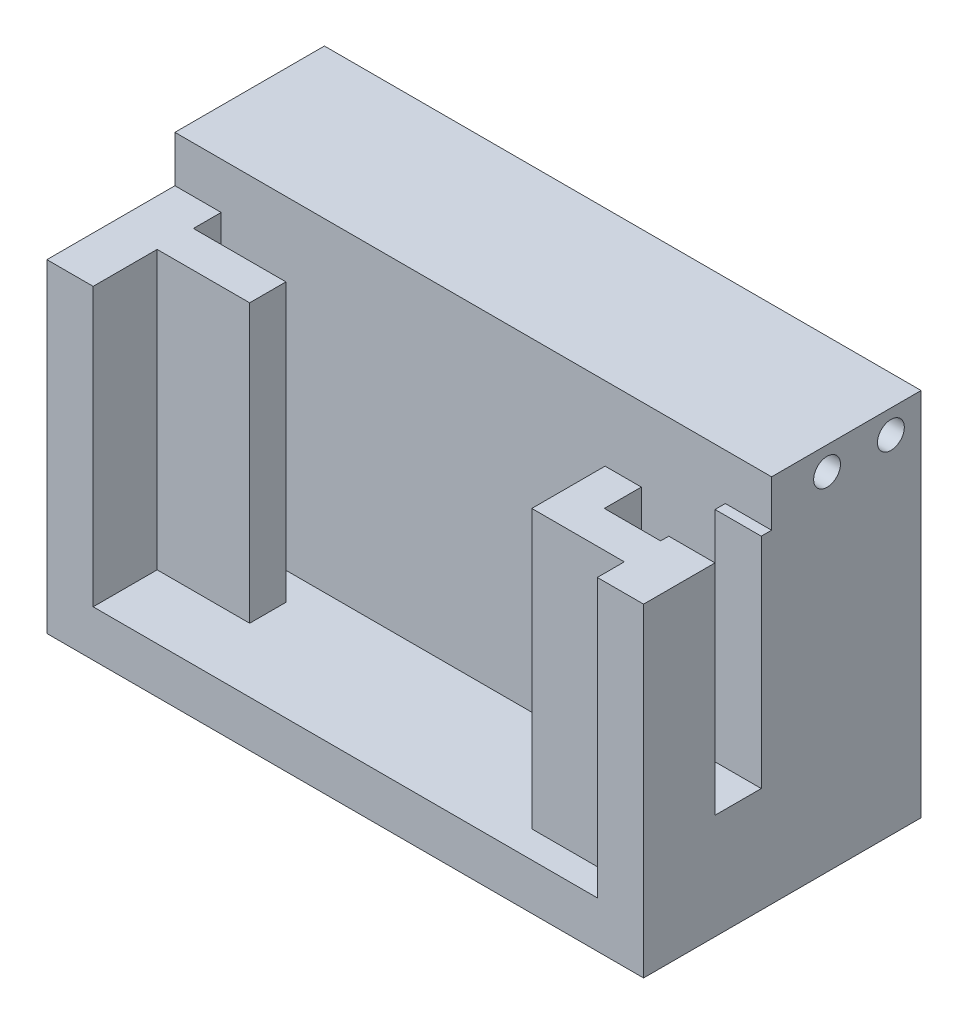
ISO-10303-21;
HEADER;
FILE_DESCRIPTION(('STEP AP214'),'2;1');
FILE_NAME('part.step','',(''),(''),'','','');
FILE_SCHEMA(('AUTOMOTIVE_DESIGN { 1 0 10303 214 1 1 1 1 }'));
ENDSEC;
DATA;
#1=APPLICATION_CONTEXT('core data for automotive mechanical design processes');
#2=APPLICATION_PROTOCOL_DEFINITION('international standard','automotive_design',2000,#1);
#3=PRODUCT_CONTEXT('',#1,'mechanical');
#4=PRODUCT('Part','Part','',(#3));
#5=PRODUCT_RELATED_PRODUCT_CATEGORY('part','',(#4));
#6=PRODUCT_DEFINITION_FORMATION('','',#4);
#7=PRODUCT_DEFINITION_CONTEXT('part definition',#1,'design');
#8=PRODUCT_DEFINITION('design','',#6,#7);
#9=PRODUCT_DEFINITION_SHAPE('','',#8);
#10=(LENGTH_UNIT() NAMED_UNIT(*) SI_UNIT(.MILLI.,.METRE.));
#11=(NAMED_UNIT(*) PLANE_ANGLE_UNIT() SI_UNIT($,.RADIAN.));
#12=(NAMED_UNIT(*) SI_UNIT($,.STERADIAN.) SOLID_ANGLE_UNIT());
#13=UNCERTAINTY_MEASURE_WITH_UNIT(LENGTH_MEASURE(1.E-05),#10,'distance_accuracy_value','');
#14=(GEOMETRIC_REPRESENTATION_CONTEXT(3) GLOBAL_UNCERTAINTY_ASSIGNED_CONTEXT((#13)) GLOBAL_UNIT_ASSIGNED_CONTEXT((#10,
#11,#12)) REPRESENTATION_CONTEXT('',''));
#15=CARTESIAN_POINT('',(0.,0.,0.));
#16=DIRECTION('',(0.,0.,1.));
#17=DIRECTION('',(1.,0.,0.));
#18=AXIS2_PLACEMENT_3D('',#15,#16,#17);
#19=CARTESIAN_POINT('',(-35.5854500032132,20.1611721611722,5.));
#20=DIRECTION('',(0.,-1.,0.));
#21=DIRECTION('',(0.,0.,-1.));
#22=AXIS2_PLACEMENT_3D('',#19,#20,#21);
#23=PLANE('',#22);
#24=DIRECTION('',(0.,0.,1.));
#25=VECTOR('',#24,1.);
#26=CARTESIAN_POINT('',(18.9145499967868,20.1611721611722,0.));
#27=LINE('',#26,#25);
#28=CARTESIAN_POINT('',(18.9145499967868,20.1611721611722,16.162047810198));
#29=VERTEX_POINT('',#28);
#30=CARTESIAN_POINT('',(18.9145499967868,20.1611721611722,17.2766885501687));
#31=VERTEX_POINT('',#30);
#32=EDGE_CURVE('E373',#29,#31,#27,.T.);
#33=ORIENTED_EDGE('',*,*,#32,.T.);
#34=DIRECTION('',(-1.,0.,0.));
#35=VECTOR('',#34,1.);
#36=CARTESIAN_POINT('',(25.9145499967868,20.1611721611722,17.2766885501687));
#37=LINE('',#36,#35);
#38=CARTESIAN_POINT('',(23.9145499967868,20.1611721611722,17.2766885501687));
#39=VERTEX_POINT('',#38);
#40=EDGE_CURVE('E234',#39,#31,#37,.T.);
#41=ORIENTED_EDGE('',*,*,#40,.F.);
#42=DIRECTION('',(0.,0.,1.));
#43=VECTOR('',#42,1.);
#44=CARTESIAN_POINT('',(23.9145499967868,20.1611721611722,0.));
#45=LINE('',#44,#43);
#46=CARTESIAN_POINT('',(23.9145499967868,20.1611721611722,16.162047810198));
#47=VERTEX_POINT('',#46);
#48=EDGE_CURVE('E364',#47,#39,#45,.T.);
#49=ORIENTED_EDGE('',*,*,#48,.F.);
#50=DIRECTION('',(1.,0.,0.));
#51=VECTOR('',#50,1.);
#52=CARTESIAN_POINT('',(-40.5854500032132,20.1611721611722,16.162047810198));
#53=LINE('',#52,#51);
#54=EDGE_CURVE('E325',#29,#47,#53,.T.);
#55=ORIENTED_EDGE('',*,*,#54,.F.);
#56=EDGE_LOOP('',(#33,#41,#49,#55));
#57=FACE_BOUND('',#56,.T.);
#58=ADVANCED_FACE('F34',(#57),#23,.F.);
#59=CARTESIAN_POINT('',(0.,-9.83882783882784,0.));
#60=DIRECTION('',(0.,-1.,0.));
#61=DIRECTION('',(0.,0.,-1.));
#62=AXIS2_PLACEMENT_3D('',#59,#60,#61);
#63=PLANE('',#62);
#64=DIRECTION('',(0.,0.,1.));
#65=VECTOR('',#64,1.);
#66=CARTESIAN_POINT('',(8.91454999678682,-9.83882783882784,23.162047810198));
#67=LINE('',#66,#65);
#68=CARTESIAN_POINT('',(8.91454999678682,-9.83882783882784,19.162047810198));
#69=VERTEX_POINT('',#68);
#70=CARTESIAN_POINT('',(8.91454999678682,-9.83882783882784,27.081023910198));
#71=VERTEX_POINT('',#70);
#72=EDGE_CURVE('E269',#69,#71,#67,.T.);
#73=ORIENTED_EDGE('',*,*,#72,.F.);
#74=DIRECTION('',(-1.,0.,0.));
#75=VECTOR('',#74,1.);
#76=CARTESIAN_POINT('',(8.91454999678682,-9.83882783882784,19.162047810198));
#77=LINE('',#76,#75);
#78=CARTESIAN_POINT('',(12.8335260967868,-9.83882783882784,19.162047810198));
#79=VERTEX_POINT('',#78);
#80=EDGE_CURVE('E259',#79,#69,#77,.T.);
#81=ORIENTED_EDGE('',*,*,#80,.F.);
#82=DIRECTION('',(0.,0.,1.));
#83=VECTOR('',#82,1.);
#84=CARTESIAN_POINT('',(12.8335260967868,-9.83882783882784,19.162047810198));
#85=LINE('',#84,#83);
#86=CARTESIAN_POINT('',(12.8335260967868,-9.83882783882784,23.162047810198));
#87=VERTEX_POINT('',#86);
#88=EDGE_CURVE('E262',#79,#87,#85,.T.);
#89=ORIENTED_EDGE('',*,*,#88,.T.);
#90=DIRECTION('',(1.,0.,0.));
#91=VECTOR('',#90,1.);
#92=CARTESIAN_POINT('',(8.91454999678682,-9.83882783882784,23.162047810198));
#93=LINE('',#92,#91);
#94=CARTESIAN_POINT('',(18.9145499967868,-9.83882783882784,23.162047810198));
#95=VERTEX_POINT('',#94);
#96=EDGE_CURVE('E285',#87,#95,#93,.T.);
#97=ORIENTED_EDGE('',*,*,#96,.T.);
#98=DIRECTION('',(0.,0.,-1.));
#99=VECTOR('',#98,1.);
#100=CARTESIAN_POINT('',(18.9145499967868,-9.83882783882784,0.));
#101=LINE('',#100,#99);
#102=CARTESIAN_POINT('',(18.9145499967868,-9.83882783882783,16.162047810198));
#103=VERTEX_POINT('',#102);
#104=EDGE_CURVE('E379',#95,#103,#101,.T.);
#105=ORIENTED_EDGE('',*,*,#104,.T.);
#106=DIRECTION('',(1.,0.,0.));
#107=VECTOR('',#106,1.);
#108=CARTESIAN_POINT('',(0.,-9.83882783882784,16.162047810198));
#109=LINE('',#108,#107);
#110=CARTESIAN_POINT('',(-35.5854500032132,-9.83882783882784,16.162047810198));
#111=VERTEX_POINT('',#110);
#112=EDGE_CURVE('E416',#111,#103,#109,.T.);
#113=ORIENTED_EDGE('',*,*,#112,.F.);
#114=DIRECTION('',(0.,0.,1.));
#115=VECTOR('',#114,1.);
#116=CARTESIAN_POINT('',(-35.5854500032132,-9.83882783882784,0.));
#117=LINE('',#116,#115);
#118=CARTESIAN_POINT('',(-35.5854500032132,-9.83882783882784,19.162047810198));
#119=VERTEX_POINT('',#118);
#120=EDGE_CURVE('E396',#111,#119,#117,.T.);
#121=ORIENTED_EDGE('',*,*,#120,.T.);
#122=DIRECTION('',(-1.,0.,0.));
#123=VECTOR('',#122,1.);
#124=CARTESIAN_POINT('',(-25.5854500032132,-9.83882783882784,19.162047810198));
#125=LINE('',#124,#123);
#126=CARTESIAN_POINT('',(-25.5854500032132,-9.83882783882784,19.162047810198));
#127=VERTEX_POINT('',#126);
#128=EDGE_CURVE('E305',#127,#119,#125,.T.);
#129=ORIENTED_EDGE('',*,*,#128,.F.);
#130=DIRECTION('',(0.,0.,-1.));
#131=VECTOR('',#130,1.);
#132=CARTESIAN_POINT('',(-25.5854500032132,-9.83882783882784,23.081023905099));
#133=LINE('',#132,#131);
#134=CARTESIAN_POINT('',(-25.5854500032132,-9.83882783882784,23.081023905099));
#135=VERTEX_POINT('',#134);
#136=EDGE_CURVE('E291',#135,#127,#133,.T.);
#137=ORIENTED_EDGE('',*,*,#136,.F.);
#138=DIRECTION('',(-1.,0.,0.));
#139=VECTOR('',#138,1.);
#140=CARTESIAN_POINT('',(-25.5854500032132,-9.83882783882784,23.081023905099));
#141=LINE('',#140,#139);
#142=CARTESIAN_POINT('',(-35.5854500032132,-9.83882783882784,23.081023905099));
#143=VERTEX_POINT('',#142);
#144=EDGE_CURVE('E307',#135,#143,#141,.T.);
#145=ORIENTED_EDGE('',*,*,#144,.T.);
#146=CARTESIAN_POINT('',(-35.5854500032132,-9.83882783882784,30.));
#147=VERTEX_POINT('',#146);
#148=EDGE_CURVE('E382',#143,#147,#117,.T.);
#149=ORIENTED_EDGE('',*,*,#148,.T.);
#150=DIRECTION('',(-1.,0.,0.));
#151=VECTOR('',#150,1.);
#152=CARTESIAN_POINT('',(-40.5854500032132,-9.83882783882784,30.));
#153=LINE('',#152,#151);
#154=CARTESIAN_POINT('',(18.9145499967868,-9.83882783882784,30.));
#155=VERTEX_POINT('',#154);
#156=EDGE_CURVE('E344',#155,#147,#153,.T.);
#157=ORIENTED_EDGE('',*,*,#156,.F.);
#158=CARTESIAN_POINT('',(18.9145499967868,-9.83882783882784,27.081023910198));
#159=VERTEX_POINT('',#158);
#160=EDGE_CURVE('E363',#155,#159,#101,.T.);
#161=ORIENTED_EDGE('',*,*,#160,.T.);
#162=DIRECTION('',(1.,0.,0.));
#163=VECTOR('',#162,1.);
#164=CARTESIAN_POINT('',(8.91454999678682,-9.83882783882784,27.081023910198));
#165=LINE('',#164,#163);
#166=EDGE_CURVE('E283',#71,#159,#165,.T.);
#167=ORIENTED_EDGE('',*,*,#166,.F.);
#168=EDGE_LOOP('',(#73,#81,#89,#97,#105,#113,#121,#129,#137,#145,#149,#157,#161,#167));
#169=FACE_BOUND('',#168,.T.);
#170=ADVANCED_FACE('F509',(#169),#63,.F.);
#171=CARTESIAN_POINT('',(8.91454999678682,20.1611721611722,23.162047810198));
#172=DIRECTION('',(0.,0.,1.));
#173=DIRECTION('',(1.,0.,0.));
#174=AXIS2_PLACEMENT_3D('',#171,#172,#173);
#175=PLANE('',#174);
#176=DIRECTION('',(0.,-1.,0.));
#177=VECTOR('',#176,1.);
#178=CARTESIAN_POINT('',(12.8335260967868,20.1611721611722,23.162047810198));
#179=LINE('',#178,#177);
#180=CARTESIAN_POINT('',(12.8335260967868,20.1611721611722,23.162047810198));
#181=VERTEX_POINT('',#180);
#182=EDGE_CURVE('E247',#181,#87,#179,.T.);
#183=ORIENTED_EDGE('',*,*,#182,.F.);
#184=DIRECTION('',(1.,0.,0.));
#185=VECTOR('',#184,1.);
#186=CARTESIAN_POINT('',(8.91454999678682,20.1611721611722,23.162047810198));
#187=LINE('',#186,#185);
#188=CARTESIAN_POINT('',(18.9145499967868,20.1611721611722,23.162047810198));
#189=VERTEX_POINT('',#188);
#190=EDGE_CURVE('E276',#181,#189,#187,.T.);
#191=ORIENTED_EDGE('',*,*,#190,.T.);
#192=DIRECTION('',(0.,-1.,0.));
#193=VECTOR('',#192,1.);
#194=CARTESIAN_POINT('',(18.9145499967868,20.1611721611722,23.162047810198));
#195=LINE('',#194,#193);
#196=EDGE_CURVE('E268',#189,#95,#195,.T.);
#197=ORIENTED_EDGE('',*,*,#196,.T.);
#198=ORIENTED_EDGE('',*,*,#96,.F.);
#199=EDGE_LOOP('',(#183,#191,#197,#198));
#200=FACE_BOUND('',#199,.T.);
#201=ADVANCED_FACE('F458',(#200),#175,.F.);
#202=CARTESIAN_POINT('',(18.9145499967868,0.,0.));
#203=DIRECTION('',(-1.,0.,0.));
#204=DIRECTION('',(0.,0.,1.));
#205=AXIS2_PLACEMENT_3D('',#202,#203,#204);
#206=PLANE('',#205);
#207=DIRECTION('',(0.,-1.,0.));
#208=VECTOR('',#207,1.);
#209=CARTESIAN_POINT('',(18.9145499967868,20.1611721611722,17.2766885501687));
#210=LINE('',#209,#208);
#211=CARTESIAN_POINT('',(18.9145499967868,-3.46393413093438,17.2766885501687));
#212=VERTEX_POINT('',#211);
#213=EDGE_CURVE('E231',#31,#212,#210,.T.);
#214=ORIENTED_EDGE('',*,*,#213,.F.);
#215=ORIENTED_EDGE('',*,*,#32,.F.);
#216=DIRECTION('',(0.,-1.,0.));
#217=VECTOR('',#216,1.);
#218=CARTESIAN_POINT('',(18.9145499967868,0.,16.162047810198));
#219=LINE('',#218,#217);
#220=EDGE_CURVE('E338',#29,#103,#219,.T.);
#221=ORIENTED_EDGE('',*,*,#220,.T.);
#222=ORIENTED_EDGE('',*,*,#104,.F.);
#223=ORIENTED_EDGE('',*,*,#196,.F.);
#224=CARTESIAN_POINT('',(18.9145499967868,20.1611721611722,22.2766885501687));
#225=VERTEX_POINT('',#224);
#226=EDGE_CURVE('E374',#225,#189,#27,.T.);
#227=ORIENTED_EDGE('',*,*,#226,.F.);
#228=DIRECTION('',(0.,1.,0.));
#229=VECTOR('',#228,1.);
#230=CARTESIAN_POINT('',(18.9145499967868,20.1611721611722,22.2766885501687));
#231=LINE('',#230,#229);
#232=CARTESIAN_POINT('',(18.9145499967868,-3.46393413093438,22.2766885501687));
#233=VERTEX_POINT('',#232);
#234=EDGE_CURVE('E228',#233,#225,#231,.T.);
#235=ORIENTED_EDGE('',*,*,#234,.F.);
#236=DIRECTION('',(0.,0.,1.));
#237=VECTOR('',#236,1.);
#238=CARTESIAN_POINT('',(18.9145499967868,-3.46393413093438,17.2766885501687));
#239=LINE('',#238,#237);
#240=EDGE_CURVE('E223',#212,#233,#239,.T.);
#241=ORIENTED_EDGE('',*,*,#240,.F.);
#242=EDGE_LOOP('',(#214,#215,#221,#222,#223,#227,#235,#241));
#243=FACE_BOUND('',#242,.T.);
#244=ADVANCED_FACE('F240',(#243),#206,.T.);
#245=CARTESIAN_POINT('',(18.9145499967868,20.1611721611722,27.081023910198));
#246=VERTEX_POINT('',#245);
#247=CARTESIAN_POINT('',(18.9145499967868,20.1611721611722,30.));
#248=VERTEX_POINT('',#247);
#249=EDGE_CURVE('E357',#246,#248,#27,.T.);
#250=ORIENTED_EDGE('',*,*,#249,.F.);
#251=DIRECTION('',(0.,1.,0.));
#252=VECTOR('',#251,1.);
#253=CARTESIAN_POINT('',(18.9145499967868,20.1611721611722,27.081023910198));
#254=LINE('',#253,#252);
#255=EDGE_CURVE('E272',#159,#246,#254,.T.);
#256=ORIENTED_EDGE('',*,*,#255,.F.);
#257=ORIENTED_EDGE('',*,*,#160,.F.);
#258=DIRECTION('',(0.,-1.,0.));
#259=VECTOR('',#258,1.);
#260=CARTESIAN_POINT('',(18.9145499967868,20.1611721611722,30.));
#261=LINE('',#260,#259);
#262=EDGE_CURVE('E372',#248,#155,#261,.T.);
#263=ORIENTED_EDGE('',*,*,#262,.F.);
#264=EDGE_LOOP('',(#250,#256,#257,#263));
#265=FACE_BOUND('',#264,.T.);
#266=ADVANCED_FACE('F540',(#265),#206,.T.);
#267=CARTESIAN_POINT('',(-35.5854500032132,0.,0.));
#268=DIRECTION('',(-1.,0.,0.));
#269=DIRECTION('',(0.,-1.,0.));
#270=AXIS2_PLACEMENT_3D('',#267,#268,#269);
#271=PLANE('',#270);
#272=DIRECTION('',(0.,-1.,0.));
#273=VECTOR('',#272,1.);
#274=CARTESIAN_POINT('',(-35.5854500032132,20.1611721611722,23.081023905099));
#275=LINE('',#274,#273);
#276=CARTESIAN_POINT('',(-35.5854500032132,20.1611721611722,23.081023905099));
#277=VERTEX_POINT('',#276);
#278=EDGE_CURVE('E287',#277,#143,#275,.T.);
#279=ORIENTED_EDGE('',*,*,#278,.F.);
#280=DIRECTION('',(0.,0.,-1.));
#281=VECTOR('',#280,1.);
#282=CARTESIAN_POINT('',(-35.5854500032132,20.1611721611722,0.));
#283=LINE('',#282,#281);
#284=CARTESIAN_POINT('',(-35.5854500032132,20.1611721611722,30.));
#285=VERTEX_POINT('',#284);
#286=EDGE_CURVE('E386',#285,#277,#283,.T.);
#287=ORIENTED_EDGE('',*,*,#286,.F.);
#288=DIRECTION('',(0.,1.,0.));
#289=VECTOR('',#288,1.);
#290=CARTESIAN_POINT('',(-35.5854500032132,20.1611721611722,30.));
#291=LINE('',#290,#289);
#292=EDGE_CURVE('E395',#147,#285,#291,.T.);
#293=ORIENTED_EDGE('',*,*,#292,.F.);
#294=ORIENTED_EDGE('',*,*,#148,.F.);
#295=EDGE_LOOP('',(#279,#287,#293,#294));
#296=FACE_BOUND('',#295,.T.);
#297=ADVANCED_FACE('F503',(#296),#271,.F.);
#298=DIRECTION('',(0.,1.,0.));
#299=VECTOR('',#298,1.);
#300=CARTESIAN_POINT('',(-35.5854500032132,20.1611721611722,19.162047810198));
#301=LINE('',#300,#299);
#302=CARTESIAN_POINT('',(-35.5854500032132,20.1611721611722,19.162047810198));
#303=VERTEX_POINT('',#302);
#304=EDGE_CURVE('E292',#119,#303,#301,.T.);
#305=ORIENTED_EDGE('',*,*,#304,.F.);
#306=ORIENTED_EDGE('',*,*,#120,.F.);
#307=DIRECTION('',(0.,-1.,0.));
#308=VECTOR('',#307,1.);
#309=CARTESIAN_POINT('',(-35.5854500032132,20.1611721611722,16.162047810198));
#310=LINE('',#309,#308);
#311=CARTESIAN_POINT('',(-35.5854500032132,20.1611721611722,16.162047810198));
#312=VERTEX_POINT('',#311);
#313=EDGE_CURVE('E333',#312,#111,#310,.T.);
#314=ORIENTED_EDGE('',*,*,#313,.F.);
#315=EDGE_CURVE('E401',#303,#312,#283,.T.);
#316=ORIENTED_EDGE('',*,*,#315,.F.);
#317=EDGE_LOOP('',(#305,#306,#314,#316));
#318=FACE_BOUND('',#317,.T.);
#319=ADVANCED_FACE('F493',(#318),#271,.F.);
#320=CARTESIAN_POINT('',(-40.5854500032132,20.1611721611722,16.162047810198));
#321=VERTEX_POINT('',#320);
#322=EDGE_CURVE('E310',#321,#312,#53,.T.);
#323=ORIENTED_EDGE('',*,*,#322,.F.);
#324=DIRECTION('',(0.,0.,-1.));
#325=VECTOR('',#324,1.);
#326=CARTESIAN_POINT('',(-40.5854500032132,20.1611721611722,0.));
#327=LINE('',#326,#325);
#328=CARTESIAN_POINT('',(-40.5854500032132,20.1611721611722,30.));
#329=VERTEX_POINT('',#328);
#330=EDGE_CURVE('E388',#329,#321,#327,.T.);
#331=ORIENTED_EDGE('',*,*,#330,.F.);
#332=DIRECTION('',(1.,0.,0.));
#333=VECTOR('',#332,1.);
#334=CARTESIAN_POINT('',(-40.5854500032132,20.1611721611722,30.));
#335=LINE('',#334,#333);
#336=EDGE_CURVE('E391',#329,#285,#335,.T.);
#337=ORIENTED_EDGE('',*,*,#336,.T.);
#338=ORIENTED_EDGE('',*,*,#286,.T.);
#339=DIRECTION('',(-1.,0.,0.));
#340=VECTOR('',#339,1.);
#341=CARTESIAN_POINT('',(-25.5854500032132,20.1611721611722,23.081023905099));
#342=LINE('',#341,#340);
#343=CARTESIAN_POINT('',(-25.5854500032132,20.1611721611722,23.081023905099));
#344=VERTEX_POINT('',#343);
#345=EDGE_CURVE('E298',#344,#277,#342,.T.);
#346=ORIENTED_EDGE('',*,*,#345,.F.);
#347=DIRECTION('',(0.,0.,1.));
#348=VECTOR('',#347,1.);
#349=CARTESIAN_POINT('',(-25.5854500032132,20.1611721611722,23.081023905099));
#350=LINE('',#349,#348);
#351=CARTESIAN_POINT('',(-25.5854500032132,20.1611721611722,19.162047810198));
#352=VERTEX_POINT('',#351);
#353=EDGE_CURVE('E296',#352,#344,#350,.T.);
#354=ORIENTED_EDGE('',*,*,#353,.F.);
#355=DIRECTION('',(-1.,0.,0.));
#356=VECTOR('',#355,1.);
#357=CARTESIAN_POINT('',(-25.5854500032132,20.1611721611722,19.162047810198));
#358=LINE('',#357,#356);
#359=EDGE_CURVE('E302',#352,#303,#358,.T.);
#360=ORIENTED_EDGE('',*,*,#359,.T.);
#361=ORIENTED_EDGE('',*,*,#315,.T.);
#362=EDGE_LOOP('',(#323,#331,#337,#338,#346,#354,#360,#361));
#363=FACE_BOUND('',#362,.T.);
#364=ADVANCED_FACE('F36',(#363),#23,.F.);
#365=CARTESIAN_POINT('',(23.9145499967868,20.1611721611722,22.2766885501687));
#366=VERTEX_POINT('',#365);
#367=CARTESIAN_POINT('',(23.9145499967868,20.1611721611722,30.));
#368=VERTEX_POINT('',#367);
#369=EDGE_CURVE('E362',#366,#368,#45,.T.);
#370=ORIENTED_EDGE('',*,*,#369,.F.);
#371=DIRECTION('',(-1.,0.,0.));
#372=VECTOR('',#371,1.);
#373=CARTESIAN_POINT('',(25.9145499967868,20.1611721611722,22.2766885501687));
#374=LINE('',#373,#372);
#375=EDGE_CURVE('E248',#366,#225,#374,.T.);
#376=ORIENTED_EDGE('',*,*,#375,.T.);
#377=ORIENTED_EDGE('',*,*,#226,.T.);
#378=ORIENTED_EDGE('',*,*,#190,.F.);
#379=DIRECTION('',(0.,0.,1.));
#380=VECTOR('',#379,1.);
#381=CARTESIAN_POINT('',(12.8335260967868,20.1611721611722,19.162047810198));
#382=LINE('',#381,#380);
#383=CARTESIAN_POINT('',(12.8335260967868,20.1611721611722,19.162047810198));
#384=VERTEX_POINT('',#383);
#385=EDGE_CURVE('E266',#384,#181,#382,.T.);
#386=ORIENTED_EDGE('',*,*,#385,.F.);
#387=DIRECTION('',(1.,0.,0.));
#388=VECTOR('',#387,1.);
#389=CARTESIAN_POINT('',(8.91454999678682,20.1611721611722,19.162047810198));
#390=LINE('',#389,#388);
#391=CARTESIAN_POINT('',(8.91454999678682,20.1611721611722,19.162047810198));
#392=VERTEX_POINT('',#391);
#393=EDGE_CURVE('E255',#392,#384,#390,.T.);
#394=ORIENTED_EDGE('',*,*,#393,.F.);
#395=DIRECTION('',(0.,0.,-1.));
#396=VECTOR('',#395,1.);
#397=CARTESIAN_POINT('',(8.91454999678682,20.1611721611722,23.162047810198));
#398=LINE('',#397,#396);
#399=CARTESIAN_POINT('',(8.91454999678682,20.1611721611722,27.081023910198));
#400=VERTEX_POINT('',#399);
#401=EDGE_CURVE('E274',#400,#392,#398,.T.);
#402=ORIENTED_EDGE('',*,*,#401,.F.);
#403=DIRECTION('',(1.,0.,0.));
#404=VECTOR('',#403,1.);
#405=CARTESIAN_POINT('',(8.91454999678682,20.1611721611722,27.081023910198));
#406=LINE('',#405,#404);
#407=EDGE_CURVE('E58',#400,#246,#406,.T.);
#408=ORIENTED_EDGE('',*,*,#407,.T.);
#409=ORIENTED_EDGE('',*,*,#249,.T.);
#410=DIRECTION('',(-1.,0.,0.));
#411=VECTOR('',#410,1.);
#412=CARTESIAN_POINT('',(23.9145499967868,20.1611721611722,30.));
#413=LINE('',#412,#411);
#414=EDGE_CURVE('E369',#368,#248,#413,.T.);
#415=ORIENTED_EDGE('',*,*,#414,.F.);
#416=EDGE_LOOP('',(#370,#376,#377,#378,#386,#394,#402,#408,#409,#415));
#417=FACE_BOUND('',#416,.T.);
#418=ADVANCED_FACE('F427',(#417),#23,.F.);
#419=CARTESIAN_POINT('',(0.,0.,0.));
#420=DIRECTION('',(0.,0.,1.));
#421=DIRECTION('',(1.,0.,0.));
#422=AXIS2_PLACEMENT_3D('',#419,#420,#421);
#423=PLANE('',#422);
#424=DIRECTION('',(0.,1.,0.));
#425=VECTOR('',#424,1.);
#426=CARTESIAN_POINT('',(23.9145499967868,20.1611721611722,0.));
#427=LINE('',#426,#425);
#428=CARTESIAN_POINT('',(23.9145499967868,-14.8388278388278,0.));
#429=VERTEX_POINT('',#428);
#430=CARTESIAN_POINT('',(23.9145499967868,25.1611721611722,0.));
#431=VERTEX_POINT('',#430);
#432=EDGE_CURVE('E360',#429,#431,#427,.T.);
#433=ORIENTED_EDGE('',*,*,#432,.F.);
#434=DIRECTION('',(1.,0.,0.));
#435=VECTOR('',#434,1.);
#436=CARTESIAN_POINT('',(-40.5854500032132,-14.8388278388278,0.));
#437=LINE('',#436,#435);
#438=CARTESIAN_POINT('',(-40.5854500032132,-14.8388278388278,0.));
#439=VERTEX_POINT('',#438);
#440=EDGE_CURVE('E348',#439,#429,#437,.T.);
#441=ORIENTED_EDGE('',*,*,#440,.F.);
#442=DIRECTION('',(0.,-1.,0.));
#443=VECTOR('',#442,1.);
#444=CARTESIAN_POINT('',(-40.5854500032132,20.1611721611722,0.));
#445=LINE('',#444,#443);
#446=CARTESIAN_POINT('',(-40.5854500032132,25.1611721611722,0.));
#447=VERTEX_POINT('',#446);
#448=EDGE_CURVE('E383',#447,#439,#445,.T.);
#449=ORIENTED_EDGE('',*,*,#448,.F.);
#450=DIRECTION('',(-1.,0.,0.));
#451=VECTOR('',#450,1.);
#452=CARTESIAN_POINT('',(-40.5854500032132,25.1611721611722,0.));
#453=LINE('',#452,#451);
#454=EDGE_CURVE('E319',#431,#447,#453,.T.);
#455=ORIENTED_EDGE('',*,*,#454,.F.);
#456=EDGE_LOOP('',(#433,#441,#449,#455));
#457=FACE_BOUND('',#456,.T.);
#458=ADVANCED_FACE('F440',(#457),#423,.F.);
#459=CARTESIAN_POINT('',(-40.5854500032132,20.1611721611722,30.));
#460=DIRECTION('',(0.,0.,-1.));
#461=DIRECTION('',(0.,1.,0.));
#462=AXIS2_PLACEMENT_3D('',#459,#460,#461);
#463=PLANE('',#462);
#464=ORIENTED_EDGE('',*,*,#292,.T.);
#465=ORIENTED_EDGE('',*,*,#336,.F.);
#466=DIRECTION('',(0.,1.,0.));
#467=VECTOR('',#466,1.);
#468=CARTESIAN_POINT('',(-40.5854500032132,20.1611721611722,30.));
#469=LINE('',#468,#467);
#470=CARTESIAN_POINT('',(-40.5854500032132,-14.8388278388278,30.));
#471=VERTEX_POINT('',#470);
#472=EDGE_CURVE('E385',#471,#329,#469,.T.);
#473=ORIENTED_EDGE('',*,*,#472,.F.);
#474=DIRECTION('',(-1.,0.,0.));
#475=VECTOR('',#474,1.);
#476=CARTESIAN_POINT('',(-40.5854500032132,-14.8388278388278,30.));
#477=LINE('',#476,#475);
#478=CARTESIAN_POINT('',(23.9145499967868,-14.8388278388278,30.));
#479=VERTEX_POINT('',#478);
#480=EDGE_CURVE('E354',#479,#471,#477,.T.);
#481=ORIENTED_EDGE('',*,*,#480,.F.);
#482=DIRECTION('',(0.,-1.,0.));
#483=VECTOR('',#482,1.);
#484=CARTESIAN_POINT('',(23.9145499967868,20.1611721611722,30.));
#485=LINE('',#484,#483);
#486=EDGE_CURVE('E367',#368,#479,#485,.T.);
#487=ORIENTED_EDGE('',*,*,#486,.F.);
#488=ORIENTED_EDGE('',*,*,#414,.T.);
#489=ORIENTED_EDGE('',*,*,#262,.T.);
#490=ORIENTED_EDGE('',*,*,#156,.T.);
#491=EDGE_LOOP('',(#464,#465,#473,#481,#487,#488,#489,#490));
#492=FACE_BOUND('',#491,.T.);
#493=ADVANCED_FACE('F433',(#492),#463,.F.);
#494=CARTESIAN_POINT('',(-40.5854500032132,0.,0.));
#495=DIRECTION('',(-1.,0.,0.));
#496=DIRECTION('',(0.,-1.,0.));
#497=AXIS2_PLACEMENT_3D('',#494,#495,#496);
#498=PLANE('',#497);
#499=CARTESIAN_POINT('',(-40.5854500032132,22.6323219061914,3.26557406092412));
#500=DIRECTION('',(-1.,0.,0.));
#501=DIRECTION('',(0.,-1.,0.));
#502=AXIS2_PLACEMENT_3D('',#499,#500,#501);
#503=CIRCLE('',#502,1.45);
#504=CARTESIAN_POINT('',(-40.5854500032132,21.1823219061914,3.26557406092412));
#505=VERTEX_POINT('',#504);
#506=EDGE_CURVE('E569',#505,#505,#503,.T.);
#507=ORIENTED_EDGE('',*,*,#506,.F.);
#508=EDGE_LOOP('',(#507));
#509=FACE_BOUND('',#508,.T.);
#510=CARTESIAN_POINT('',(-40.5854500032132,22.6323219061914,10.1655740609241));
#511=DIRECTION('',(-1.,0.,0.));
#512=DIRECTION('',(0.,-1.,0.));
#513=AXIS2_PLACEMENT_3D('',#510,#511,#512);
#514=CIRCLE('',#513,1.45);
#515=CARTESIAN_POINT('',(-40.5854500032132,21.1823219061914,10.1655740609241));
#516=VERTEX_POINT('',#515);
#517=EDGE_CURVE('E572',#516,#516,#514,.T.);
#518=ORIENTED_EDGE('',*,*,#517,.F.);
#519=EDGE_LOOP('',(#518));
#520=FACE_BOUND('',#519,.T.);
#521=ORIENTED_EDGE('',*,*,#448,.T.);
#522=DIRECTION('',(0.,0.,-1.));
#523=VECTOR('',#522,1.);
#524=CARTESIAN_POINT('',(-40.5854500032132,-14.8388278388278,30.));
#525=LINE('',#524,#523);
#526=EDGE_CURVE('E345',#471,#439,#525,.T.);
#527=ORIENTED_EDGE('',*,*,#526,.F.);
#528=ORIENTED_EDGE('',*,*,#472,.T.);
#529=ORIENTED_EDGE('',*,*,#330,.T.);
#530=DIRECTION('',(0.,-1.,0.));
#531=VECTOR('',#530,1.);
#532=CARTESIAN_POINT('',(-40.5854500032132,25.1611721611722,16.162047810198));
#533=LINE('',#532,#531);
#534=CARTESIAN_POINT('',(-40.5854500032132,25.1611721611722,16.162047810198));
#535=VERTEX_POINT('',#534);
#536=EDGE_CURVE('E328',#535,#321,#533,.T.);
#537=ORIENTED_EDGE('',*,*,#536,.F.);
#538=DIRECTION('',(0.,0.,1.));
#539=VECTOR('',#538,1.);
#540=CARTESIAN_POINT('',(-40.5854500032132,25.1611721611722,0.));
#541=LINE('',#540,#539);
#542=EDGE_CURVE('E311',#447,#535,#541,.T.);
#543=ORIENTED_EDGE('',*,*,#542,.F.);
#544=EDGE_LOOP('',(#521,#527,#528,#529,#537,#543));
#545=FACE_BOUND('',#544,.T.);
#546=ADVANCED_FACE('F496',(#509,#520,#545),#498,.T.);
#547=CARTESIAN_POINT('',(23.9145499967868,0.,0.));
#548=DIRECTION('',(-1.,0.,0.));
#549=DIRECTION('',(0.,0.,1.));
#550=AXIS2_PLACEMENT_3D('',#547,#548,#549);
#551=PLANE('',#550);
#552=CARTESIAN_POINT('',(23.9145499967868,22.6323219011722,3.26557406));
#553=DIRECTION('',(1.,0.,0.));
#554=DIRECTION('',(0.,0.,-1.));
#555=AXIS2_PLACEMENT_3D('',#552,#553,#554);
#556=CIRCLE('',#555,1.45);
#557=CARTESIAN_POINT('',(23.9145499967868,22.6323219011722,1.81557406));
#558=VERTEX_POINT('',#557);
#559=EDGE_CURVE('E579',#558,#558,#556,.T.);
#560=ORIENTED_EDGE('',*,*,#559,.F.);
#561=EDGE_LOOP('',(#560));
#562=FACE_BOUND('',#561,.T.);
#563=CARTESIAN_POINT('',(23.9145499967868,22.6323219011722,10.16557406));
#564=DIRECTION('',(1.,0.,0.));
#565=DIRECTION('',(0.,0.,-1.));
#566=AXIS2_PLACEMENT_3D('',#563,#564,#565);
#567=CIRCLE('',#566,1.45);
#568=CARTESIAN_POINT('',(23.9145499967868,22.6323219011722,8.71557406));
#569=VERTEX_POINT('',#568);
#570=EDGE_CURVE('E585',#569,#569,#567,.T.);
#571=ORIENTED_EDGE('',*,*,#570,.F.);
#572=EDGE_LOOP('',(#571));
#573=FACE_BOUND('',#572,.T.);
#574=ORIENTED_EDGE('',*,*,#48,.T.);
#575=DIRECTION('',(0.,-1.,0.));
#576=VECTOR('',#575,1.);
#577=CARTESIAN_POINT('',(23.9145499967868,0.,17.2766885501687));
#578=LINE('',#577,#576);
#579=CARTESIAN_POINT('',(23.9145499967868,-3.46393413093438,17.2766885501687));
#580=VERTEX_POINT('',#579);
#581=EDGE_CURVE('E11',#39,#580,#578,.T.);
#582=ORIENTED_EDGE('',*,*,#581,.T.);
#583=DIRECTION('',(0.,0.,1.));
#584=VECTOR('',#583,1.);
#585=CARTESIAN_POINT('',(23.9145499967868,-3.46393413093438,0.));
#586=LINE('',#585,#584);
#587=CARTESIAN_POINT('',(23.9145499967868,-3.46393413093438,22.2766885501687));
#588=VERTEX_POINT('',#587);
#589=EDGE_CURVE('E226',#580,#588,#586,.T.);
#590=ORIENTED_EDGE('',*,*,#589,.T.);
#591=DIRECTION('',(0.,1.,0.));
#592=VECTOR('',#591,1.);
#593=CARTESIAN_POINT('',(23.9145499967868,0.,22.2766885501687));
#594=LINE('',#593,#592);
#595=EDGE_CURVE('E43',#588,#366,#594,.T.);
#596=ORIENTED_EDGE('',*,*,#595,.T.);
#597=ORIENTED_EDGE('',*,*,#369,.T.);
#598=ORIENTED_EDGE('',*,*,#486,.T.);
#599=DIRECTION('',(0.,0.,1.));
#600=VECTOR('',#599,1.);
#601=CARTESIAN_POINT('',(23.9145499967868,-14.8388278388278,30.));
#602=LINE('',#601,#600);
#603=EDGE_CURVE('E351',#429,#479,#602,.T.);
#604=ORIENTED_EDGE('',*,*,#603,.F.);
#605=ORIENTED_EDGE('',*,*,#432,.T.);
#606=DIRECTION('',(0.,0.,-1.));
#607=VECTOR('',#606,1.);
#608=CARTESIAN_POINT('',(23.9145499967868,25.1611721611722,0.));
#609=LINE('',#608,#607);
#610=CARTESIAN_POINT('',(23.9145499967868,25.1611721611722,16.162047810198));
#611=VERTEX_POINT('',#610);
#612=EDGE_CURVE('E316',#611,#431,#609,.T.);
#613=ORIENTED_EDGE('',*,*,#612,.F.);
#614=DIRECTION('',(0.,-1.,0.));
#615=VECTOR('',#614,1.);
#616=CARTESIAN_POINT('',(23.9145499967868,25.1611721611722,16.162047810198));
#617=LINE('',#616,#615);
#618=EDGE_CURVE('E322',#611,#47,#617,.T.);
#619=ORIENTED_EDGE('',*,*,#618,.T.);
#620=EDGE_LOOP('',(#574,#582,#590,#596,#597,#598,#604,#605,#613,#619));
#621=FACE_BOUND('',#620,.T.);
#622=ADVANCED_FACE('F424',(#562,#573,#621),#551,.F.);
#623=CARTESIAN_POINT('',(0.,-14.8388278388278,0.));
#624=DIRECTION('',(0.,-1.,0.));
#625=DIRECTION('',(0.,0.,-1.));
#626=AXIS2_PLACEMENT_3D('',#623,#624,#625);
#627=PLANE('',#626);
#628=ORIENTED_EDGE('',*,*,#526,.T.);
#629=ORIENTED_EDGE('',*,*,#440,.T.);
#630=ORIENTED_EDGE('',*,*,#603,.T.);
#631=ORIENTED_EDGE('',*,*,#480,.T.);
#632=EDGE_LOOP('',(#628,#629,#630,#631));
#633=FACE_BOUND('',#632,.T.);
#634=ADVANCED_FACE('F436',(#633),#627,.T.);
#635=CARTESIAN_POINT('',(19.4145499967868,20.1611721611722,16.162047810198));
#636=DIRECTION('',(0.,0.,-1.));
#637=DIRECTION('',(0.,1.,0.));
#638=AXIS2_PLACEMENT_3D('',#635,#636,#637);
#639=PLANE('',#638);
#640=ORIENTED_EDGE('',*,*,#220,.F.);
#641=ORIENTED_EDGE('',*,*,#54,.T.);
#642=ORIENTED_EDGE('',*,*,#618,.F.);
#643=DIRECTION('',(1.,0.,0.));
#644=VECTOR('',#643,1.);
#645=CARTESIAN_POINT('',(-40.5854500032132,25.1611721611722,16.162047810198));
#646=LINE('',#645,#644);
#647=EDGE_CURVE('E314',#535,#611,#646,.T.);
#648=ORIENTED_EDGE('',*,*,#647,.F.);
#649=ORIENTED_EDGE('',*,*,#536,.T.);
#650=ORIENTED_EDGE('',*,*,#322,.T.);
#651=ORIENTED_EDGE('',*,*,#313,.T.);
#652=ORIENTED_EDGE('',*,*,#112,.T.);
#653=EDGE_LOOP('',(#640,#641,#642,#648,#649,#650,#651,#652));
#654=FACE_BOUND('',#653,.T.);
#655=ADVANCED_FACE('F451',(#654),#639,.F.);
#656=CARTESIAN_POINT('',(0.,25.1611721611722,0.));
#657=DIRECTION('',(0.,1.,0.));
#658=DIRECTION('',(0.,0.,1.));
#659=AXIS2_PLACEMENT_3D('',#656,#657,#658);
#660=PLANE('',#659);
#661=ORIENTED_EDGE('',*,*,#542,.T.);
#662=ORIENTED_EDGE('',*,*,#647,.T.);
#663=ORIENTED_EDGE('',*,*,#612,.T.);
#664=ORIENTED_EDGE('',*,*,#454,.T.);
#665=EDGE_LOOP('',(#661,#662,#663,#664));
#666=FACE_BOUND('',#665,.T.);
#667=ADVANCED_FACE('F444',(#666),#660,.T.);
#668=CARTESIAN_POINT('',(-25.5854500032132,20.1611721611722,23.081023905099));
#669=DIRECTION('',(0.,0.,-1.));
#670=DIRECTION('',(-1.,0.,0.));
#671=AXIS2_PLACEMENT_3D('',#668,#669,#670);
#672=PLANE('',#671);
#673=ORIENTED_EDGE('',*,*,#278,.T.);
#674=ORIENTED_EDGE('',*,*,#144,.F.);
#675=DIRECTION('',(0.,-1.,0.));
#676=VECTOR('',#675,1.);
#677=CARTESIAN_POINT('',(-25.5854500032132,20.1611721611722,23.081023905099));
#678=LINE('',#677,#676);
#679=EDGE_CURVE('E288',#344,#135,#678,.T.);
#680=ORIENTED_EDGE('',*,*,#679,.F.);
#681=ORIENTED_EDGE('',*,*,#345,.T.);
#682=EDGE_LOOP('',(#673,#674,#680,#681));
#683=FACE_BOUND('',#682,.T.);
#684=ADVANCED_FACE('F506',(#683),#672,.F.);
#685=CARTESIAN_POINT('',(-25.5854500032132,20.1611721611722,19.162047810198));
#686=DIRECTION('',(0.,0.,1.));
#687=DIRECTION('',(1.,0.,0.));
#688=AXIS2_PLACEMENT_3D('',#685,#686,#687);
#689=PLANE('',#688);
#690=ORIENTED_EDGE('',*,*,#304,.T.);
#691=ORIENTED_EDGE('',*,*,#359,.F.);
#692=DIRECTION('',(0.,1.,0.));
#693=VECTOR('',#692,1.);
#694=CARTESIAN_POINT('',(-25.5854500032132,20.1611721611722,19.162047810198));
#695=LINE('',#694,#693);
#696=EDGE_CURVE('E294',#127,#352,#695,.T.);
#697=ORIENTED_EDGE('',*,*,#696,.F.);
#698=ORIENTED_EDGE('',*,*,#128,.T.);
#699=EDGE_LOOP('',(#690,#691,#697,#698));
#700=FACE_BOUND('',#699,.T.);
#701=ADVANCED_FACE('F516',(#700),#689,.F.);
#702=CARTESIAN_POINT('',(-25.5854500032132,0.,0.));
#703=DIRECTION('',(1.,0.,0.));
#704=DIRECTION('',(0.,1.,0.));
#705=AXIS2_PLACEMENT_3D('',#702,#703,#704);
#706=PLANE('',#705);
#707=ORIENTED_EDGE('',*,*,#679,.T.);
#708=ORIENTED_EDGE('',*,*,#136,.T.);
#709=ORIENTED_EDGE('',*,*,#696,.T.);
#710=ORIENTED_EDGE('',*,*,#353,.T.);
#711=EDGE_LOOP('',(#707,#708,#709,#710));
#712=FACE_BOUND('',#711,.T.);
#713=ADVANCED_FACE('F514',(#712),#706,.T.);
#714=CARTESIAN_POINT('',(8.91454999678682,20.1611721611722,27.081023910198));
#715=DIRECTION('',(0.,0.,-1.));
#716=DIRECTION('',(0.,1.,0.));
#717=AXIS2_PLACEMENT_3D('',#714,#715,#716);
#718=PLANE('',#717);
#719=ORIENTED_EDGE('',*,*,#255,.T.);
#720=ORIENTED_EDGE('',*,*,#407,.F.);
#721=DIRECTION('',(0.,1.,0.));
#722=VECTOR('',#721,1.);
#723=CARTESIAN_POINT('',(8.91454999678682,20.1611721611722,27.081023910198));
#724=LINE('',#723,#722);
#725=EDGE_CURVE('E271',#71,#400,#724,.T.);
#726=ORIENTED_EDGE('',*,*,#725,.F.);
#727=ORIENTED_EDGE('',*,*,#166,.T.);
#728=EDGE_LOOP('',(#719,#720,#726,#727));
#729=FACE_BOUND('',#728,.T.);
#730=ADVANCED_FACE('F523',(#729),#718,.F.);
#731=CARTESIAN_POINT('',(8.91454999678682,0.,0.));
#732=DIRECTION('',(-1.,0.,0.));
#733=DIRECTION('',(0.,0.,1.));
#734=AXIS2_PLACEMENT_3D('',#731,#732,#733);
#735=PLANE('',#734);
#736=ORIENTED_EDGE('',*,*,#401,.T.);
#737=DIRECTION('',(0.,1.,0.));
#738=VECTOR('',#737,1.);
#739=CARTESIAN_POINT('',(8.91454999678682,20.1611721611722,19.162047810198));
#740=LINE('',#739,#738);
#741=EDGE_CURVE('E252',#69,#392,#740,.T.);
#742=ORIENTED_EDGE('',*,*,#741,.F.);
#743=ORIENTED_EDGE('',*,*,#72,.T.);
#744=ORIENTED_EDGE('',*,*,#725,.T.);
#745=EDGE_LOOP('',(#736,#742,#743,#744));
#746=FACE_BOUND('',#745,.T.);
#747=ADVANCED_FACE('F641',(#746),#735,.T.);
#748=CARTESIAN_POINT('',(12.8335260967868,20.1611721611722,19.162047810198));
#749=DIRECTION('',(-1.,0.,0.));
#750=DIRECTION('',(0.,-1.,0.));
#751=AXIS2_PLACEMENT_3D('',#748,#749,#750);
#752=PLANE('',#751);
#753=ORIENTED_EDGE('',*,*,#182,.T.);
#754=ORIENTED_EDGE('',*,*,#88,.F.);
#755=DIRECTION('',(0.,-1.,0.));
#756=VECTOR('',#755,1.);
#757=CARTESIAN_POINT('',(12.8335260967868,20.1611721611722,19.162047810198));
#758=LINE('',#757,#756);
#759=EDGE_CURVE('E257',#384,#79,#758,.T.);
#760=ORIENTED_EDGE('',*,*,#759,.F.);
#761=ORIENTED_EDGE('',*,*,#385,.T.);
#762=EDGE_LOOP('',(#753,#754,#760,#761));
#763=FACE_BOUND('',#762,.T.);
#764=ADVANCED_FACE('F637',(#763),#752,.F.);
#765=CARTESIAN_POINT('',(0.,0.,19.162047810198));
#766=DIRECTION('',(0.,0.,1.));
#767=DIRECTION('',(1.,0.,0.));
#768=AXIS2_PLACEMENT_3D('',#765,#766,#767);
#769=PLANE('',#768);
#770=ORIENTED_EDGE('',*,*,#741,.T.);
#771=ORIENTED_EDGE('',*,*,#393,.T.);
#772=ORIENTED_EDGE('',*,*,#759,.T.);
#773=ORIENTED_EDGE('',*,*,#80,.T.);
#774=EDGE_LOOP('',(#770,#771,#772,#773));
#775=FACE_BOUND('',#774,.T.);
#776=ADVANCED_FACE('F634',(#775),#769,.F.);
#777=CARTESIAN_POINT('',(25.9145499967868,20.1611721611722,17.2766885501687));
#778=DIRECTION('',(0.,0.,-1.));
#779=DIRECTION('',(-1.,0.,0.));
#780=AXIS2_PLACEMENT_3D('',#777,#778,#779);
#781=PLANE('',#780);
#782=ORIENTED_EDGE('',*,*,#40,.T.);
#783=ORIENTED_EDGE('',*,*,#213,.T.);
#784=DIRECTION('',(-1.,0.,0.));
#785=VECTOR('',#784,1.);
#786=CARTESIAN_POINT('',(25.9145499967868,-3.46393413093438,17.2766885501687));
#787=LINE('',#786,#785);
#788=EDGE_CURVE('E219',#580,#212,#787,.T.);
#789=ORIENTED_EDGE('',*,*,#788,.F.);
#790=ORIENTED_EDGE('',*,*,#581,.F.);
#791=EDGE_LOOP('',(#782,#783,#789,#790));
#792=FACE_BOUND('',#791,.T.);
#793=ADVANCED_FACE('F232',(#792),#781,.F.);
#794=CARTESIAN_POINT('',(25.9145499967868,20.1611721611722,22.2766885501687));
#795=DIRECTION('',(0.,0.,1.));
#796=DIRECTION('',(0.,-1.,0.));
#797=AXIS2_PLACEMENT_3D('',#794,#795,#796);
#798=PLANE('',#797);
#799=DIRECTION('',(-1.,0.,0.));
#800=VECTOR('',#799,1.);
#801=CARTESIAN_POINT('',(25.9145499967868,-3.46393413093438,22.2766885501687));
#802=LINE('',#801,#800);
#803=EDGE_CURVE('E50',#588,#233,#802,.T.);
#804=ORIENTED_EDGE('',*,*,#803,.T.);
#805=ORIENTED_EDGE('',*,*,#234,.T.);
#806=ORIENTED_EDGE('',*,*,#375,.F.);
#807=ORIENTED_EDGE('',*,*,#595,.F.);
#808=EDGE_LOOP('',(#804,#805,#806,#807));
#809=FACE_BOUND('',#808,.T.);
#810=ADVANCED_FACE('F627',(#809),#798,.F.);
#811=CARTESIAN_POINT('',(25.9145499967868,-3.46393413093438,17.2766885501687));
#812=DIRECTION('',(0.,-1.,0.));
#813=DIRECTION('',(0.,0.,-1.));
#814=AXIS2_PLACEMENT_3D('',#811,#812,#813);
#815=PLANE('',#814);
#816=ORIENTED_EDGE('',*,*,#788,.T.);
#817=ORIENTED_EDGE('',*,*,#240,.T.);
#818=ORIENTED_EDGE('',*,*,#803,.F.);
#819=ORIENTED_EDGE('',*,*,#589,.F.);
#820=EDGE_LOOP('',(#816,#817,#818,#819));
#821=FACE_BOUND('',#820,.T.);
#822=ADVANCED_FACE('F221',(#821),#815,.F.);
#823=CARTESIAN_POINT('',(-33.5854500032132,22.6323219061914,10.1655740609241));
#824=DIRECTION('',(-1.,0.,0.));
#825=DIRECTION('',(0.,-1.,0.));
#826=AXIS2_PLACEMENT_3D('',#823,#824,#825);
#827=CYLINDRICAL_SURFACE('',#826,1.45);
#828=CARTESIAN_POINT('',(-33.5854500032132,22.6323219061914,10.1655740609241));
#829=DIRECTION('',(-1.,0.,0.));
#830=DIRECTION('',(0.,-1.,0.));
#831=AXIS2_PLACEMENT_3D('',#828,#829,#830);
#832=CIRCLE('',#831,1.45);
#833=CARTESIAN_POINT('',(-33.5854500032132,21.1823219061914,10.1655740609241));
#834=VERTEX_POINT('',#833);
#835=EDGE_CURVE('E574',#834,#834,#832,.T.);
#836=ORIENTED_EDGE('',*,*,#835,.F.);
#837=EDGE_LOOP('',(#836));
#838=FACE_BOUND('',#837,.T.);
#839=ORIENTED_EDGE('',*,*,#517,.T.);
#840=EDGE_LOOP('',(#839));
#841=FACE_BOUND('',#840,.T.);
#842=ADVANCED_FACE('F622',(#838,#841),#827,.F.);
#843=CARTESIAN_POINT('',(-33.5854500032132,22.6323219061914,10.1655740609241));
#844=DIRECTION('',(-1.,0.,0.));
#845=DIRECTION('',(0.,-1.,0.));
#846=AXIS2_PLACEMENT_3D('',#843,#844,#845);
#847=PLANE('',#846);
#848=ORIENTED_EDGE('',*,*,#835,.T.);
#849=EDGE_LOOP('',(#848));
#850=FACE_BOUND('',#849,.T.);
#851=ADVANCED_FACE('F618',(#850),#847,.T.);
#852=CARTESIAN_POINT('',(-33.5854500032132,22.6323219061914,3.26557406092412));
#853=DIRECTION('',(-1.,0.,0.));
#854=DIRECTION('',(0.,-1.,0.));
#855=AXIS2_PLACEMENT_3D('',#852,#853,#854);
#856=CYLINDRICAL_SURFACE('',#855,1.45);
#857=CARTESIAN_POINT('',(-33.5854500032132,22.6323219061914,3.26557406092412));
#858=DIRECTION('',(-1.,0.,0.));
#859=DIRECTION('',(0.,-1.,0.));
#860=AXIS2_PLACEMENT_3D('',#857,#858,#859);
#861=CIRCLE('',#860,1.45);
#862=CARTESIAN_POINT('',(-33.5854500032132,21.1823219061914,3.26557406092412));
#863=VERTEX_POINT('',#862);
#864=EDGE_CURVE('E238',#863,#863,#861,.T.);
#865=ORIENTED_EDGE('',*,*,#864,.F.);
#866=EDGE_LOOP('',(#865));
#867=FACE_BOUND('',#866,.T.);
#868=ORIENTED_EDGE('',*,*,#506,.T.);
#869=EDGE_LOOP('',(#868));
#870=FACE_BOUND('',#869,.T.);
#871=ADVANCED_FACE('F610',(#867,#870),#856,.F.);
#872=CARTESIAN_POINT('',(-33.5854500032132,22.6323219061914,3.26557406092412));
#873=DIRECTION('',(-1.,0.,0.));
#874=DIRECTION('',(0.,-1.,0.));
#875=AXIS2_PLACEMENT_3D('',#872,#873,#874);
#876=PLANE('',#875);
#877=ORIENTED_EDGE('',*,*,#864,.T.);
#878=EDGE_LOOP('',(#877));
#879=FACE_BOUND('',#878,.T.);
#880=ADVANCED_FACE('F601',(#879),#876,.T.);
#881=CARTESIAN_POINT('',(16.9145499967868,22.6323219011722,10.16557406));
#882=DIRECTION('',(1.,0.,0.));
#883=DIRECTION('',(0.,0.,-1.));
#884=AXIS2_PLACEMENT_3D('',#881,#882,#883);
#885=CYLINDRICAL_SURFACE('',#884,1.45);
#886=CARTESIAN_POINT('',(16.9145499967868,22.6323219011722,10.16557406));
#887=DIRECTION('',(1.,0.,0.));
#888=DIRECTION('',(0.,0.,-1.));
#889=AXIS2_PLACEMENT_3D('',#886,#887,#888);
#890=CIRCLE('',#889,1.45);
#891=CARTESIAN_POINT('',(16.9145499967868,22.6323219011722,8.71557406));
#892=VERTEX_POINT('',#891);
#893=EDGE_CURVE('E588',#892,#892,#890,.T.);
#894=ORIENTED_EDGE('',*,*,#893,.F.);
#895=EDGE_LOOP('',(#894));
#896=FACE_BOUND('',#895,.T.);
#897=ORIENTED_EDGE('',*,*,#570,.T.);
#898=EDGE_LOOP('',(#897));
#899=FACE_BOUND('',#898,.T.);
#900=ADVANCED_FACE('F598',(#896,#899),#885,.F.);
#901=CARTESIAN_POINT('',(16.9145499967868,22.6323219011722,10.16557406));
#902=DIRECTION('',(1.,0.,0.));
#903=DIRECTION('',(0.,0.,-1.));
#904=AXIS2_PLACEMENT_3D('',#901,#902,#903);
#905=PLANE('',#904);
#906=ORIENTED_EDGE('',*,*,#893,.T.);
#907=EDGE_LOOP('',(#906));
#908=FACE_BOUND('',#907,.T.);
#909=ADVANCED_FACE('F600',(#908),#905,.T.);
#910=CARTESIAN_POINT('',(16.9145499967868,22.6323219011722,3.26557406));
#911=DIRECTION('',(1.,0.,0.));
#912=DIRECTION('',(0.,0.,-1.));
#913=AXIS2_PLACEMENT_3D('',#910,#911,#912);
#914=CYLINDRICAL_SURFACE('',#913,1.45);
#915=CARTESIAN_POINT('',(16.9145499967868,22.6323219011722,3.26557406));
#916=DIRECTION('',(1.,0.,0.));
#917=DIRECTION('',(0.,0.,-1.));
#918=AXIS2_PLACEMENT_3D('',#915,#916,#917);
#919=CIRCLE('',#918,1.45);
#920=CARTESIAN_POINT('',(16.9145499967868,22.6323219011722,1.81557406));
#921=VERTEX_POINT('',#920);
#922=EDGE_CURVE('E575',#921,#921,#919,.T.);
#923=ORIENTED_EDGE('',*,*,#922,.F.);
#924=EDGE_LOOP('',(#923));
#925=FACE_BOUND('',#924,.T.);
#926=ORIENTED_EDGE('',*,*,#559,.T.);
#927=EDGE_LOOP('',(#926));
#928=FACE_BOUND('',#927,.T.);
#929=ADVANCED_FACE('F594',(#925,#928),#914,.F.);
#930=CARTESIAN_POINT('',(16.9145499967868,22.6323219011722,3.26557406));
#931=DIRECTION('',(1.,0.,0.));
#932=DIRECTION('',(0.,0.,-1.));
#933=AXIS2_PLACEMENT_3D('',#930,#931,#932);
#934=PLANE('',#933);
#935=ORIENTED_EDGE('',*,*,#922,.T.);
#936=EDGE_LOOP('',(#935));
#937=FACE_BOUND('',#936,.T.);
#938=ADVANCED_FACE('F780',(#937),#934,.T.);
#939=CLOSED_SHELL('',(#58,#170,#201,#244,#266,#297,#319,#364,#418,#458,#493,#546,#622,#634,#655,
#667,#684,#701,#713,#730,#747,#764,#776,#793,#810,#822,#842,#851,#871,#880,#900,#909,#929,#938));
#940=CARTESIAN_POINT('',(-35.5854500032132,-9.83882783882784,5.));
#941=VERTEX_POINT('',#940);
#942=CARTESIAN_POINT('',(-35.5854500032132,-9.83882783882784,11.162047810198));
#943=VERTEX_POINT('',#942);
#944=EDGE_CURVE('E392',#941,#943,#117,.T.);
#945=ORIENTED_EDGE('',*,*,#944,.T.);
#946=DIRECTION('',(1.,0.,0.));
#947=VECTOR('',#946,1.);
#948=CARTESIAN_POINT('',(0.,-9.83882783882784,11.162047810198));
#949=LINE('',#948,#947);
#950=CARTESIAN_POINT('',(18.9145499967868,-9.83882783882784,11.162047810198));
#951=VERTEX_POINT('',#950);
#952=EDGE_CURVE('E419',#943,#951,#949,.T.);
#953=ORIENTED_EDGE('',*,*,#952,.T.);
#954=CARTESIAN_POINT('',(18.9145499967868,-9.83882783882784,5.));
#955=VERTEX_POINT('',#954);
#956=EDGE_CURVE('E376',#951,#955,#101,.T.);
#957=ORIENTED_EDGE('',*,*,#956,.T.);
#958=DIRECTION('',(1.,0.,0.));
#959=VECTOR('',#958,1.);
#960=CARTESIAN_POINT('',(-35.5854500032132,-9.83882783882784,5.));
#961=LINE('',#960,#959);
#962=EDGE_CURVE('E407',#941,#955,#961,.T.);
#963=ORIENTED_EDGE('',*,*,#962,.F.);
#964=EDGE_LOOP('',(#945,#953,#957,#963));
#965=FACE_BOUND('',#964,.T.);
#966=ADVANCED_FACE('F466',(#965),#63,.F.);
#967=CARTESIAN_POINT('',(0.,0.,5.));
#968=DIRECTION('',(0.,0.,1.));
#969=DIRECTION('',(1.,0.,0.));
#970=AXIS2_PLACEMENT_3D('',#967,#968,#969);
#971=PLANE('',#970);
#972=DIRECTION('',(0.,-1.,0.));
#973=VECTOR('',#972,1.);
#974=CARTESIAN_POINT('',(-35.5854500032132,20.1611721611722,5.));
#975=LINE('',#974,#973);
#976=CARTESIAN_POINT('',(-35.5854500032132,20.1611721611722,5.));
#977=VERTEX_POINT('',#976);
#978=EDGE_CURVE('E404',#977,#941,#975,.T.);
#979=ORIENTED_EDGE('',*,*,#978,.T.);
#980=ORIENTED_EDGE('',*,*,#962,.T.);
#981=DIRECTION('',(0.,1.,0.));
#982=VECTOR('',#981,1.);
#983=CARTESIAN_POINT('',(18.9145499967868,20.1611721611722,5.));
#984=LINE('',#983,#982);
#985=CARTESIAN_POINT('',(18.9145499967868,20.1611721611722,5.));
#986=VERTEX_POINT('',#985);
#987=EDGE_CURVE('E410',#955,#986,#984,.T.);
#988=ORIENTED_EDGE('',*,*,#987,.T.);
#989=DIRECTION('',(-1.,0.,0.));
#990=VECTOR('',#989,1.);
#991=CARTESIAN_POINT('',(-35.5854500032132,20.1611721611722,5.));
#992=LINE('',#991,#990);
#993=EDGE_CURVE('E413',#986,#977,#992,.T.);
#994=ORIENTED_EDGE('',*,*,#993,.T.);
#995=EDGE_LOOP('',(#979,#980,#988,#994));
#996=FACE_BOUND('',#995,.T.);
#997=ADVANCED_FACE('F473',(#996),#971,.T.);
#998=CARTESIAN_POINT('',(-35.5854500032132,20.1611721611722,11.162047810198));
#999=VERTEX_POINT('',#998);
#1000=EDGE_CURVE('E398',#999,#977,#283,.T.);
#1001=ORIENTED_EDGE('',*,*,#1000,.F.);
#1002=DIRECTION('',(0.,-1.,0.));
#1003=VECTOR('',#1002,1.);
#1004=CARTESIAN_POINT('',(-35.5854500032132,20.1611721611722,11.162047810198));
#1005=LINE('',#1004,#1003);
#1006=EDGE_CURVE('E331',#999,#943,#1005,.T.);
#1007=ORIENTED_EDGE('',*,*,#1006,.T.);
#1008=ORIENTED_EDGE('',*,*,#944,.F.);
#1009=ORIENTED_EDGE('',*,*,#978,.F.);
#1010=EDGE_LOOP('',(#1001,#1007,#1008,#1009));
#1011=FACE_BOUND('',#1010,.T.);
#1012=ADVANCED_FACE('F477',(#1011),#271,.F.);
#1013=CARTESIAN_POINT('',(19.4145499967868,20.1611721611722,11.162047810198));
#1014=DIRECTION('',(0.,0.,-1.));
#1015=DIRECTION('',(0.,1.,0.));
#1016=AXIS2_PLACEMENT_3D('',#1013,#1014,#1015);
#1017=PLANE('',#1016);
#1018=DIRECTION('',(-1.,0.,0.));
#1019=VECTOR('',#1018,1.);
#1020=CARTESIAN_POINT('',(19.4145499967868,20.1611721611722,11.162047810198));
#1021=LINE('',#1020,#1019);
#1022=CARTESIAN_POINT('',(18.9145499967868,20.1611721611722,11.162047810198));
#1023=VERTEX_POINT('',#1022);
#1024=EDGE_CURVE('E336',#1023,#999,#1021,.T.);
#1025=ORIENTED_EDGE('',*,*,#1024,.F.);
#1026=DIRECTION('',(0.,-1.,0.));
#1027=VECTOR('',#1026,1.);
#1028=CARTESIAN_POINT('',(18.9145499967868,0.,11.162047810198));
#1029=LINE('',#1028,#1027);
#1030=EDGE_CURVE('E341',#1023,#951,#1029,.T.);
#1031=ORIENTED_EDGE('',*,*,#1030,.T.);
#1032=ORIENTED_EDGE('',*,*,#952,.F.);
#1033=ORIENTED_EDGE('',*,*,#1006,.F.);
#1034=EDGE_LOOP('',(#1025,#1031,#1032,#1033));
#1035=FACE_BOUND('',#1034,.T.);
#1036=ADVANCED_FACE('F481',(#1035),#1017,.T.);
#1037=ORIENTED_EDGE('',*,*,#1030,.F.);
#1038=EDGE_CURVE('E370',#986,#1023,#27,.T.);
#1039=ORIENTED_EDGE('',*,*,#1038,.F.);
#1040=ORIENTED_EDGE('',*,*,#987,.F.);
#1041=ORIENTED_EDGE('',*,*,#956,.F.);
#1042=EDGE_LOOP('',(#1037,#1039,#1040,#1041));
#1043=FACE_BOUND('',#1042,.T.);
#1044=ADVANCED_FACE('F471',(#1043),#206,.T.);
#1045=CARTESIAN_POINT('',(0.,20.1611721611722,0.));
#1046=DIRECTION('',(0.,1.,0.));
#1047=DIRECTION('',(0.,0.,1.));
#1048=AXIS2_PLACEMENT_3D('',#1045,#1046,#1047);
#1049=PLANE('',#1048);
#1050=ORIENTED_EDGE('',*,*,#993,.F.);
#1051=ORIENTED_EDGE('',*,*,#1038,.T.);
#1052=ORIENTED_EDGE('',*,*,#1024,.T.);
#1053=ORIENTED_EDGE('',*,*,#1000,.T.);
#1054=EDGE_LOOP('',(#1050,#1051,#1052,#1053));
#1055=FACE_BOUND('',#1054,.T.);
#1056=ADVANCED_FACE('F483',(#1055),#1049,.F.);
#1057=CLOSED_SHELL('',(#966,#997,#1012,#1036,#1044,#1056));
#1058=ORIENTED_CLOSED_SHELL('',*,#1057,.T.);
#1059=BREP_WITH_VOIDS('B2',#939,(#1058));
#1060=ADVANCED_BREP_SHAPE_REPRESENTATION('',(#18,#1059),#14);
#1061=SHAPE_DEFINITION_REPRESENTATION(#9,#1060);
ENDSEC;
END-ISO-10303-21;
